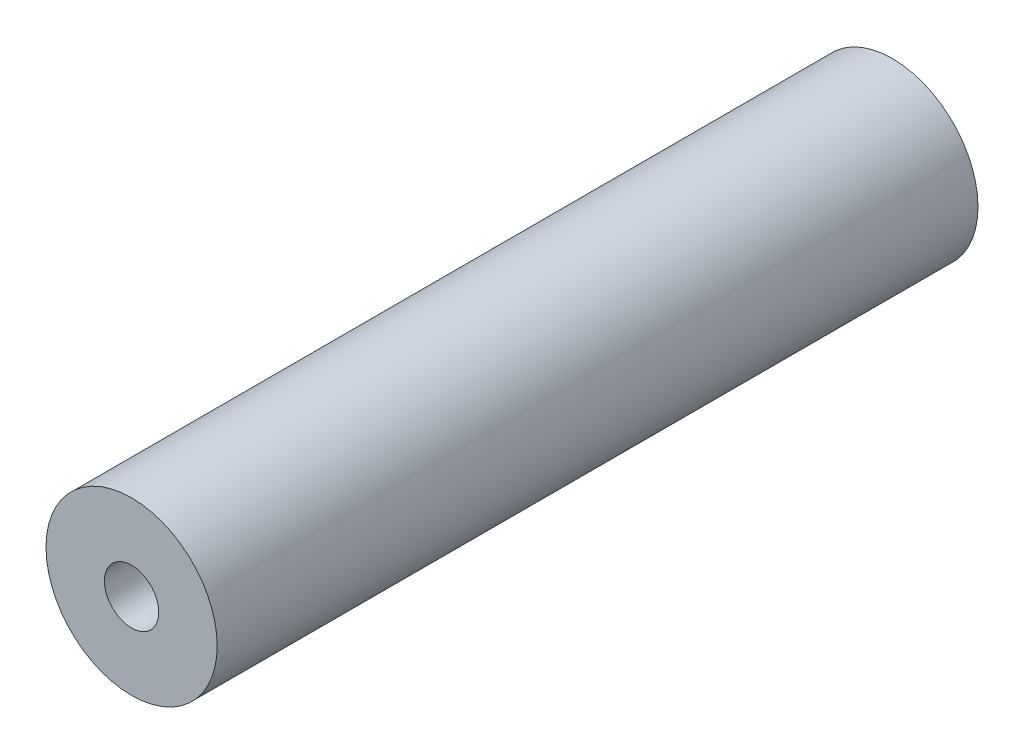
ISO-10303-21;
HEADER;
FILE_DESCRIPTION(('STEP AP214'),'2;1');
FILE_NAME('part.step','',(''),(''),'','','');
FILE_SCHEMA(('AUTOMOTIVE_DESIGN { 1 0 10303 214 1 1 1 1 }'));
ENDSEC;
DATA;
#1=APPLICATION_CONTEXT('core data for automotive mechanical design processes');
#2=APPLICATION_PROTOCOL_DEFINITION('international standard','automotive_design',2000,#1);
#3=PRODUCT_CONTEXT('',#1,'mechanical');
#4=PRODUCT('Part','Part','',(#3));
#5=PRODUCT_RELATED_PRODUCT_CATEGORY('part','',(#4));
#6=PRODUCT_DEFINITION_FORMATION('','',#4);
#7=PRODUCT_DEFINITION_CONTEXT('part definition',#1,'design');
#8=PRODUCT_DEFINITION('design','',#6,#7);
#9=PRODUCT_DEFINITION_SHAPE('','',#8);
#10=(LENGTH_UNIT() NAMED_UNIT(*) SI_UNIT(.MILLI.,.METRE.));
#11=(NAMED_UNIT(*) PLANE_ANGLE_UNIT() SI_UNIT($,.RADIAN.));
#12=(NAMED_UNIT(*) SI_UNIT($,.STERADIAN.) SOLID_ANGLE_UNIT());
#13=UNCERTAINTY_MEASURE_WITH_UNIT(LENGTH_MEASURE(1.E-05),#10,'distance_accuracy_value','');
#14=(GEOMETRIC_REPRESENTATION_CONTEXT(3) GLOBAL_UNCERTAINTY_ASSIGNED_CONTEXT((#13)) GLOBAL_UNIT_ASSIGNED_CONTEXT((#10,
#11,#12)) REPRESENTATION_CONTEXT('',''));
#15=CARTESIAN_POINT('',(0.,0.,0.));
#16=DIRECTION('',(0.,0.,1.));
#17=DIRECTION('',(1.,0.,0.));
#18=AXIS2_PLACEMENT_3D('',#15,#16,#17);
#19=CARTESIAN_POINT('',(0.,0.,28.));
#20=DIRECTION('',(0.,0.,1.));
#21=DIRECTION('',(1.,0.,0.));
#22=AXIS2_PLACEMENT_3D('',#19,#20,#21);
#23=PLANE('',#22);
#24=CARTESIAN_POINT('',(0.,0.,28.));
#25=DIRECTION('',(0.,0.,1.));
#26=DIRECTION('',(1.,0.,0.));
#27=AXIS2_PLACEMENT_3D('',#24,#25,#26);
#28=CIRCLE('',#27,3.15);
#29=CARTESIAN_POINT('',(3.15,0.,28.));
#30=VERTEX_POINT('',#29);
#31=EDGE_CURVE('E10',#30,#30,#28,.T.);
#32=ORIENTED_EDGE('',*,*,#31,.T.);
#33=EDGE_LOOP('',(#32));
#34=FACE_BOUND('',#33,.T.);
#35=CARTESIAN_POINT('',(0.,0.,28.));
#36=DIRECTION('',(0.,0.,1.));
#37=DIRECTION('',(1.,0.,0.));
#38=AXIS2_PLACEMENT_3D('',#35,#36,#37);
#39=CIRCLE('',#38,1.);
#40=CARTESIAN_POINT('',(1.,0.,28.));
#41=VERTEX_POINT('',#40);
#42=EDGE_CURVE('E44',#41,#41,#39,.T.);
#43=ORIENTED_EDGE('',*,*,#42,.F.);
#44=EDGE_LOOP('',(#43));
#45=FACE_BOUND('',#44,.T.);
#46=ADVANCED_FACE('F33',(#34,#45),#23,.T.);
#47=CARTESIAN_POINT('',(0.,0.,0.));
#48=DIRECTION('',(0.,0.,1.));
#49=DIRECTION('',(1.,0.,0.));
#50=AXIS2_PLACEMENT_3D('',#47,#48,#49);
#51=PLANE('',#50);
#52=CARTESIAN_POINT('',(0.,0.,0.));
#53=DIRECTION('',(0.,0.,1.));
#54=DIRECTION('',(1.,0.,0.));
#55=AXIS2_PLACEMENT_3D('',#52,#53,#54);
#56=CIRCLE('',#55,3.15);
#57=CARTESIAN_POINT('',(3.15,0.,0.));
#58=VERTEX_POINT('',#57);
#59=EDGE_CURVE('E37',#58,#58,#56,.T.);
#60=ORIENTED_EDGE('',*,*,#59,.F.);
#61=EDGE_LOOP('',(#60));
#62=FACE_BOUND('',#61,.T.);
#63=CARTESIAN_POINT('',(0.,0.,0.));
#64=DIRECTION('',(0.,0.,1.));
#65=DIRECTION('',(1.,0.,0.));
#66=AXIS2_PLACEMENT_3D('',#63,#64,#65);
#67=CIRCLE('',#66,1.);
#68=CARTESIAN_POINT('',(1.,0.,0.));
#69=VERTEX_POINT('',#68);
#70=EDGE_CURVE('E46',#69,#69,#67,.T.);
#71=ORIENTED_EDGE('',*,*,#70,.T.);
#72=EDGE_LOOP('',(#71));
#73=FACE_BOUND('',#72,.T.);
#74=ADVANCED_FACE('F56',(#62,#73),#51,.F.);
#75=CARTESIAN_POINT('',(0.,0.,28.));
#76=DIRECTION('',(0.,0.,-1.));
#77=DIRECTION('',(-1.,0.,0.));
#78=AXIS2_PLACEMENT_3D('',#75,#76,#77);
#79=CYLINDRICAL_SURFACE('',#78,3.15);
#80=ORIENTED_EDGE('',*,*,#31,.F.);
#81=EDGE_LOOP('',(#80));
#82=FACE_BOUND('',#81,.T.);
#83=ORIENTED_EDGE('',*,*,#59,.T.);
#84=EDGE_LOOP('',(#83));
#85=FACE_BOUND('',#84,.T.);
#86=ADVANCED_FACE('F35',(#82,#85),#79,.T.);
#87=CARTESIAN_POINT('',(0.,0.,28.));
#88=DIRECTION('',(0.,0.,-1.));
#89=DIRECTION('',(-1.,0.,0.));
#90=AXIS2_PLACEMENT_3D('',#87,#88,#89);
#91=CYLINDRICAL_SURFACE('',#90,1.);
#92=ORIENTED_EDGE('',*,*,#42,.T.);
#93=EDGE_LOOP('',(#92));
#94=FACE_BOUND('',#93,.T.);
#95=ORIENTED_EDGE('',*,*,#70,.F.);
#96=EDGE_LOOP('',(#95));
#97=FACE_BOUND('',#96,.T.);
#98=ADVANCED_FACE('F52',(#94,#97),#91,.F.);
#99=CLOSED_SHELL('',(#46,#74,#86,#98));
#100=MANIFOLD_SOLID_BREP('B2',#99);
#101=ADVANCED_BREP_SHAPE_REPRESENTATION('',(#18,#100),#14);
#102=SHAPE_DEFINITION_REPRESENTATION(#9,#101);
ENDSEC;
END-ISO-10303-21;
